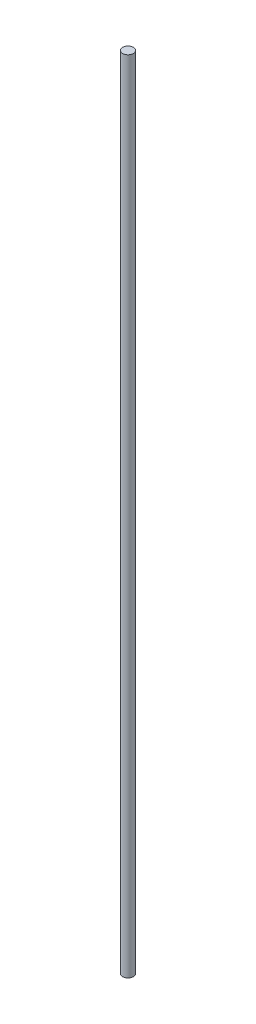
ISO-10303-21;
HEADER;
FILE_DESCRIPTION(('STEP AP214'),'2;1');
FILE_NAME('part.step','',(''),(''),'','','');
FILE_SCHEMA(('AUTOMOTIVE_DESIGN { 1 0 10303 214 1 1 1 1 }'));
ENDSEC;
DATA;
#1=APPLICATION_CONTEXT('core data for automotive mechanical design processes');
#2=APPLICATION_PROTOCOL_DEFINITION('international standard','automotive_design',2000,#1);
#3=PRODUCT_CONTEXT('',#1,'mechanical');
#4=PRODUCT('Part','Part','',(#3));
#5=PRODUCT_RELATED_PRODUCT_CATEGORY('part','',(#4));
#6=PRODUCT_DEFINITION_FORMATION('','',#4);
#7=PRODUCT_DEFINITION_CONTEXT('part definition',#1,'design');
#8=PRODUCT_DEFINITION('design','',#6,#7);
#9=PRODUCT_DEFINITION_SHAPE('','',#8);
#10=(LENGTH_UNIT() NAMED_UNIT(*) SI_UNIT(.MILLI.,.METRE.));
#11=(NAMED_UNIT(*) PLANE_ANGLE_UNIT() SI_UNIT($,.RADIAN.));
#12=(NAMED_UNIT(*) SI_UNIT($,.STERADIAN.) SOLID_ANGLE_UNIT());
#13=UNCERTAINTY_MEASURE_WITH_UNIT(LENGTH_MEASURE(1.E-05),#10,'distance_accuracy_value','');
#14=(GEOMETRIC_REPRESENTATION_CONTEXT(3) GLOBAL_UNCERTAINTY_ASSIGNED_CONTEXT((#13)) GLOBAL_UNIT_ASSIGNED_CONTEXT((#10,
#11,#12)) REPRESENTATION_CONTEXT('',''));
#15=CARTESIAN_POINT('',(0.,0.,0.));
#16=DIRECTION('',(0.,0.,1.));
#17=DIRECTION('',(1.,0.,0.));
#18=AXIS2_PLACEMENT_3D('',#15,#16,#17);
#19=CARTESIAN_POINT('',(0.,1300.,0.));
#20=DIRECTION('',(0.,-1.,0.));
#21=DIRECTION('',(0.,0.,-1.));
#22=AXIS2_PLACEMENT_3D('',#19,#20,#21);
#23=CYLINDRICAL_SURFACE('',#22,8.75);
#24=CARTESIAN_POINT('',(0.,1300.,0.));
#25=DIRECTION('',(0.,1.,0.));
#26=DIRECTION('',(0.,0.,1.));
#27=AXIS2_PLACEMENT_3D('',#24,#25,#26);
#28=CIRCLE('',#27,8.75);
#29=CARTESIAN_POINT('',(0.,1300.,8.75));
#30=VERTEX_POINT('',#29);
#31=EDGE_CURVE('E10',#30,#30,#28,.T.);
#32=ORIENTED_EDGE('',*,*,#31,.F.);
#33=EDGE_LOOP('',(#32));
#34=FACE_BOUND('',#33,.T.);
#35=CARTESIAN_POINT('',(0.,0.,0.));
#36=DIRECTION('',(0.,1.,0.));
#37=DIRECTION('',(0.,0.,1.));
#38=AXIS2_PLACEMENT_3D('',#35,#36,#37);
#39=CIRCLE('',#38,8.75);
#40=CARTESIAN_POINT('',(0.,0.,8.75));
#41=VERTEX_POINT('',#40);
#42=EDGE_CURVE('E34',#41,#41,#39,.T.);
#43=ORIENTED_EDGE('',*,*,#42,.T.);
#44=EDGE_LOOP('',(#43));
#45=FACE_BOUND('',#44,.T.);
#46=ADVANCED_FACE('F31',(#34,#45),#23,.T.);
#47=CARTESIAN_POINT('',(0.,1300.,0.));
#48=DIRECTION('',(0.,1.,0.));
#49=DIRECTION('',(0.,0.,1.));
#50=AXIS2_PLACEMENT_3D('',#47,#48,#49);
#51=PLANE('',#50);
#52=ORIENTED_EDGE('',*,*,#31,.T.);
#53=EDGE_LOOP('',(#52));
#54=FACE_BOUND('',#53,.T.);
#55=ADVANCED_FACE('F46',(#54),#51,.T.);
#56=CARTESIAN_POINT('',(0.,0.,0.));
#57=DIRECTION('',(0.,1.,0.));
#58=DIRECTION('',(0.,0.,1.));
#59=AXIS2_PLACEMENT_3D('',#56,#57,#58);
#60=PLANE('',#59);
#61=ORIENTED_EDGE('',*,*,#42,.F.);
#62=EDGE_LOOP('',(#61));
#63=FACE_BOUND('',#62,.T.);
#64=ADVANCED_FACE('F44',(#63),#60,.F.);
#65=CLOSED_SHELL('',(#46,#55,#64));
#66=MANIFOLD_SOLID_BREP('B2',#65);
#67=ADVANCED_BREP_SHAPE_REPRESENTATION('',(#18,#66),#14);
#68=SHAPE_DEFINITION_REPRESENTATION(#9,#67);
ENDSEC;
END-ISO-10303-21;
